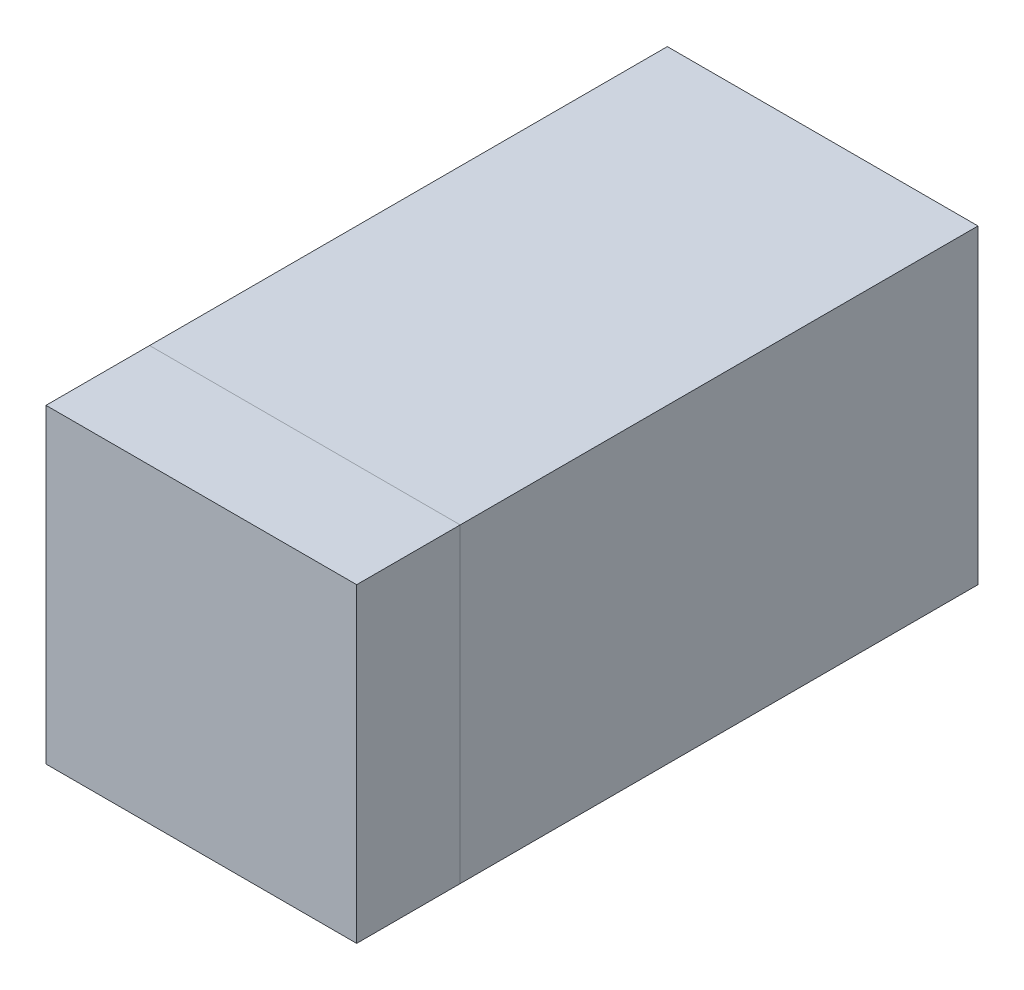
ISO-10303-21;
HEADER;
FILE_DESCRIPTION(('STEP AP214'),'2;1');
FILE_NAME('part.step','',(''),(''),'','','');
FILE_SCHEMA(('AUTOMOTIVE_DESIGN { 1 0 10303 214 1 1 1 1 }'));
ENDSEC;
DATA;
#1=APPLICATION_CONTEXT('core data for automotive mechanical design processes');
#2=APPLICATION_PROTOCOL_DEFINITION('international standard','automotive_design',2000,#1);
#3=PRODUCT_CONTEXT('',#1,'mechanical');
#4=PRODUCT('Part','Part','',(#3));
#5=PRODUCT_RELATED_PRODUCT_CATEGORY('part','',(#4));
#6=PRODUCT_DEFINITION_FORMATION('','',#4);
#7=PRODUCT_DEFINITION_CONTEXT('part definition',#1,'design');
#8=PRODUCT_DEFINITION('design','',#6,#7);
#9=PRODUCT_DEFINITION_SHAPE('','',#8);
#10=(LENGTH_UNIT() NAMED_UNIT(*) SI_UNIT(.MILLI.,.METRE.));
#11=(NAMED_UNIT(*) PLANE_ANGLE_UNIT() SI_UNIT($,.RADIAN.));
#12=(NAMED_UNIT(*) SI_UNIT($,.STERADIAN.) SOLID_ANGLE_UNIT());
#13=UNCERTAINTY_MEASURE_WITH_UNIT(LENGTH_MEASURE(1.E-05),#10,'distance_accuracy_value','');
#14=(GEOMETRIC_REPRESENTATION_CONTEXT(3) GLOBAL_UNCERTAINTY_ASSIGNED_CONTEXT((#13)) GLOBAL_UNIT_ASSIGNED_CONTEXT((#10,
#11,#12)) REPRESENTATION_CONTEXT('',''));
#15=CARTESIAN_POINT('',(0.,0.,0.));
#16=DIRECTION('',(0.,0.,1.));
#17=DIRECTION('',(1.,0.,0.));
#18=AXIS2_PLACEMENT_3D('',#15,#16,#17);
#19=CARTESIAN_POINT('',(47.625,-2.54,139.7));
#20=DIRECTION('',(1.,0.,0.));
#21=DIRECTION('',(0.,0.,-1.));
#22=AXIS2_PLACEMENT_3D('',#19,#20,#21);
#23=PLANE('',#22);
#24=DIRECTION('',(0.,0.,-1.));
#25=VECTOR('',#24,1.);
#26=CARTESIAN_POINT('',(47.625,0.,139.7));
#27=LINE('',#26,#25);
#28=CARTESIAN_POINT('',(47.625,0.,139.7));
#29=VERTEX_POINT('',#28);
#30=CARTESIAN_POINT('',(47.625,0.,12.7));
#31=VERTEX_POINT('',#30);
#32=EDGE_CURVE('E115',#29,#31,#27,.T.);
#33=ORIENTED_EDGE('',*,*,#32,.T.);
#34=DIRECTION('',(0.,1.,0.));
#35=VECTOR('',#34,1.);
#36=CARTESIAN_POINT('',(47.625,-2.54,12.7));
#37=LINE('',#36,#35);
#38=CARTESIAN_POINT('',(47.625,-2.54,12.7));
#39=VERTEX_POINT('',#38);
#40=EDGE_CURVE('E12',#39,#31,#37,.T.);
#41=ORIENTED_EDGE('',*,*,#40,.F.);
#42=DIRECTION('',(0.,0.,-1.));
#43=VECTOR('',#42,1.);
#44=CARTESIAN_POINT('',(47.625,-2.54,139.7));
#45=LINE('',#44,#43);
#46=CARTESIAN_POINT('',(47.625,-2.54,139.7));
#47=VERTEX_POINT('',#46);
#48=EDGE_CURVE('E103',#47,#39,#45,.T.);
#49=ORIENTED_EDGE('',*,*,#48,.F.);
#50=DIRECTION('',(0.,1.,0.));
#51=VECTOR('',#50,1.);
#52=CARTESIAN_POINT('',(47.625,-2.54,139.7));
#53=LINE('',#52,#51);
#54=EDGE_CURVE('E111',#47,#29,#53,.T.);
#55=ORIENTED_EDGE('',*,*,#54,.T.);
#56=EDGE_LOOP('',(#33,#41,#49,#55));
#57=FACE_BOUND('',#56,.T.);
#58=ADVANCED_FACE('F52',(#57),#23,.F.);
#59=CARTESIAN_POINT('',(47.625,-2.54,12.7));
#60=DIRECTION('',(0.,0.,1.));
#61=DIRECTION('',(1.,0.,0.));
#62=AXIS2_PLACEMENT_3D('',#59,#60,#61);
#63=PLANE('',#62);
#64=DIRECTION('',(1.,0.,0.));
#65=VECTOR('',#64,1.);
#66=CARTESIAN_POINT('',(47.625,0.,12.7));
#67=LINE('',#66,#65);
#68=CARTESIAN_POINT('',(63.5,0.,12.7));
#69=VERTEX_POINT('',#68);
#70=EDGE_CURVE('E107',#31,#69,#67,.T.);
#71=ORIENTED_EDGE('',*,*,#70,.T.);
#72=DIRECTION('',(0.,1.,0.));
#73=VECTOR('',#72,1.);
#74=CARTESIAN_POINT('',(63.5,-2.54,12.7));
#75=LINE('',#74,#73);
#76=CARTESIAN_POINT('',(63.5,-2.54,12.7));
#77=VERTEX_POINT('',#76);
#78=EDGE_CURVE('E60',#77,#69,#75,.T.);
#79=ORIENTED_EDGE('',*,*,#78,.F.);
#80=DIRECTION('',(1.,0.,0.));
#81=VECTOR('',#80,1.);
#82=CARTESIAN_POINT('',(47.625,-2.54,12.7));
#83=LINE('',#82,#81);
#84=EDGE_CURVE('E98',#39,#77,#83,.T.);
#85=ORIENTED_EDGE('',*,*,#84,.F.);
#86=ORIENTED_EDGE('',*,*,#40,.T.);
#87=EDGE_LOOP('',(#71,#79,#85,#86));
#88=FACE_BOUND('',#87,.T.);
#89=ADVANCED_FACE('F106',(#88),#63,.F.);
#90=CARTESIAN_POINT('',(63.5,-2.54,139.7));
#91=DIRECTION('',(-1.,0.,0.));
#92=DIRECTION('',(0.,0.,1.));
#93=AXIS2_PLACEMENT_3D('',#90,#91,#92);
#94=PLANE('',#93);
#95=DIRECTION('',(0.,0.,1.));
#96=VECTOR('',#95,1.);
#97=CARTESIAN_POINT('',(63.5,0.,139.7));
#98=LINE('',#97,#96);
#99=CARTESIAN_POINT('',(63.5,0.,139.7));
#100=VERTEX_POINT('',#99);
#101=EDGE_CURVE('E85',#69,#100,#98,.T.);
#102=ORIENTED_EDGE('',*,*,#101,.T.);
#103=DIRECTION('',(0.,1.,0.));
#104=VECTOR('',#103,1.);
#105=CARTESIAN_POINT('',(63.5,-2.54,139.7));
#106=LINE('',#105,#104);
#107=CARTESIAN_POINT('',(63.5,-2.54,139.7));
#108=VERTEX_POINT('',#107);
#109=EDGE_CURVE('E108',#108,#100,#106,.T.);
#110=ORIENTED_EDGE('',*,*,#109,.F.);
#111=DIRECTION('',(0.,0.,1.));
#112=VECTOR('',#111,1.);
#113=CARTESIAN_POINT('',(63.5,-2.54,139.7));
#114=LINE('',#113,#112);
#115=EDGE_CURVE('E101',#77,#108,#114,.T.);
#116=ORIENTED_EDGE('',*,*,#115,.F.);
#117=ORIENTED_EDGE('',*,*,#78,.T.);
#118=EDGE_LOOP('',(#102,#110,#116,#117));
#119=FACE_BOUND('',#118,.T.);
#120=ADVANCED_FACE('F109',(#119),#94,.F.);
#121=CARTESIAN_POINT('',(47.625,-2.54,139.7));
#122=DIRECTION('',(0.,0.,-1.));
#123=DIRECTION('',(-1.,0.,0.));
#124=AXIS2_PLACEMENT_3D('',#121,#122,#123);
#125=PLANE('',#124);
#126=DIRECTION('',(-1.,0.,0.));
#127=VECTOR('',#126,1.);
#128=CARTESIAN_POINT('',(47.625,0.,139.7));
#129=LINE('',#128,#127);
#130=EDGE_CURVE('E91',#100,#29,#129,.T.);
#131=ORIENTED_EDGE('',*,*,#130,.T.);
#132=ORIENTED_EDGE('',*,*,#54,.F.);
#133=DIRECTION('',(-1.,0.,0.));
#134=VECTOR('',#133,1.);
#135=CARTESIAN_POINT('',(47.625,-2.54,139.7));
#136=LINE('',#135,#134);
#137=EDGE_CURVE('E68',#108,#47,#136,.T.);
#138=ORIENTED_EDGE('',*,*,#137,.F.);
#139=ORIENTED_EDGE('',*,*,#109,.T.);
#140=EDGE_LOOP('',(#131,#132,#138,#139));
#141=FACE_BOUND('',#140,.T.);
#142=ADVANCED_FACE('F122',(#141),#125,.F.);
#143=CARTESIAN_POINT('',(0.,-2.54,0.));
#144=DIRECTION('',(0.,-1.,0.));
#145=DIRECTION('',(0.,0.,-1.));
#146=AXIS2_PLACEMENT_3D('',#143,#144,#145);
#147=PLANE('',#146);
#148=ORIENTED_EDGE('',*,*,#48,.T.);
#149=ORIENTED_EDGE('',*,*,#84,.T.);
#150=ORIENTED_EDGE('',*,*,#115,.T.);
#151=ORIENTED_EDGE('',*,*,#137,.T.);
#152=EDGE_LOOP('',(#148,#149,#150,#151));
#153=FACE_BOUND('',#152,.T.);
#154=ADVANCED_FACE('F99',(#153),#147,.T.);
#155=CARTESIAN_POINT('',(0.,0.,0.));
#156=DIRECTION('',(0.,-1.,0.));
#157=DIRECTION('',(0.,0.,-1.));
#158=AXIS2_PLACEMENT_3D('',#155,#156,#157);
#159=PLANE('',#158);
#160=ORIENTED_EDGE('',*,*,#32,.F.);
#161=ORIENTED_EDGE('',*,*,#130,.F.);
#162=ORIENTED_EDGE('',*,*,#101,.F.);
#163=ORIENTED_EDGE('',*,*,#70,.F.);
#164=EDGE_LOOP('',(#160,#161,#162,#163));
#165=FACE_BOUND('',#164,.T.);
#166=ADVANCED_FACE('F125',(#165),#159,.F.);
#167=CLOSED_SHELL('',(#58,#89,#120,#142,#154,#166));
#168=MANIFOLD_SOLID_BREP('B2',#167);
#169=CARTESIAN_POINT('',(12.7,-2.54,12.7));
#170=DIRECTION('',(1.,0.,0.));
#171=DIRECTION('',(0.,0.,-1.));
#172=AXIS2_PLACEMENT_3D('',#169,#170,#171);
#173=PLANE('',#172);
#174=DIRECTION('',(0.,0.,-1.));
#175=VECTOR('',#174,1.);
#176=CARTESIAN_POINT('',(12.7,0.,12.7));
#177=LINE('',#176,#175);
#178=CARTESIAN_POINT('',(12.7,0.,139.7));
#179=VERTEX_POINT('',#178);
#180=CARTESIAN_POINT('',(12.7,0.,12.7));
#181=VERTEX_POINT('',#180);
#182=EDGE_CURVE('E249',#179,#181,#177,.T.);
#183=ORIENTED_EDGE('',*,*,#182,.T.);
#184=DIRECTION('',(0.,1.,0.));
#185=VECTOR('',#184,1.);
#186=CARTESIAN_POINT('',(12.7,-2.54,12.7));
#187=LINE('',#186,#185);
#188=CARTESIAN_POINT('',(12.7,-2.54,12.7));
#189=VERTEX_POINT('',#188);
#190=EDGE_CURVE('E50',#189,#181,#187,.T.);
#191=ORIENTED_EDGE('',*,*,#190,.F.);
#192=DIRECTION('',(0.,0.,-1.));
#193=VECTOR('',#192,1.);
#194=CARTESIAN_POINT('',(12.7,-2.54,12.7));
#195=LINE('',#194,#193);
#196=CARTESIAN_POINT('',(12.7,-2.54,139.7));
#197=VERTEX_POINT('',#196);
#198=EDGE_CURVE('E237',#197,#189,#195,.T.);
#199=ORIENTED_EDGE('',*,*,#198,.F.);
#200=DIRECTION('',(0.,1.,0.));
#201=VECTOR('',#200,1.);
#202=CARTESIAN_POINT('',(12.7,-2.54,139.7));
#203=LINE('',#202,#201);
#204=EDGE_CURVE('E245',#197,#179,#203,.T.);
#205=ORIENTED_EDGE('',*,*,#204,.T.);
#206=EDGE_LOOP('',(#183,#191,#199,#205));
#207=FACE_BOUND('',#206,.T.);
#208=ADVANCED_FACE('F186',(#207),#173,.F.);
#209=CARTESIAN_POINT('',(12.7,-2.54,12.7));
#210=DIRECTION('',(0.,0.,1.));
#211=DIRECTION('',(1.,0.,0.));
#212=AXIS2_PLACEMENT_3D('',#209,#210,#211);
#213=PLANE('',#212);
#214=DIRECTION('',(1.,0.,0.));
#215=VECTOR('',#214,1.);
#216=CARTESIAN_POINT('',(12.7,0.,12.7));
#217=LINE('',#216,#215);
#218=CARTESIAN_POINT('',(28.575,0.,12.7));
#219=VERTEX_POINT('',#218);
#220=EDGE_CURVE('E241',#181,#219,#217,.T.);
#221=ORIENTED_EDGE('',*,*,#220,.T.);
#222=DIRECTION('',(0.,1.,0.));
#223=VECTOR('',#222,1.);
#224=CARTESIAN_POINT('',(28.575,-2.54,12.7));
#225=LINE('',#224,#223);
#226=CARTESIAN_POINT('',(28.575,-2.54,12.7));
#227=VERTEX_POINT('',#226);
#228=EDGE_CURVE('E194',#227,#219,#225,.T.);
#229=ORIENTED_EDGE('',*,*,#228,.F.);
#230=DIRECTION('',(1.,0.,0.));
#231=VECTOR('',#230,1.);
#232=CARTESIAN_POINT('',(12.7,-2.54,12.7));
#233=LINE('',#232,#231);
#234=EDGE_CURVE('E232',#189,#227,#233,.T.);
#235=ORIENTED_EDGE('',*,*,#234,.F.);
#236=ORIENTED_EDGE('',*,*,#190,.T.);
#237=EDGE_LOOP('',(#221,#229,#235,#236));
#238=FACE_BOUND('',#237,.T.);
#239=ADVANCED_FACE('F240',(#238),#213,.F.);
#240=CARTESIAN_POINT('',(28.575,-2.54,12.7));
#241=DIRECTION('',(-1.,0.,0.));
#242=DIRECTION('',(0.,0.,1.));
#243=AXIS2_PLACEMENT_3D('',#240,#241,#242);
#244=PLANE('',#243);
#245=DIRECTION('',(0.,0.,1.));
#246=VECTOR('',#245,1.);
#247=CARTESIAN_POINT('',(28.575,0.,12.7));
#248=LINE('',#247,#246);
#249=CARTESIAN_POINT('',(28.575,0.,139.7));
#250=VERTEX_POINT('',#249);
#251=EDGE_CURVE('E219',#219,#250,#248,.T.);
#252=ORIENTED_EDGE('',*,*,#251,.T.);
#253=DIRECTION('',(0.,1.,0.));
#254=VECTOR('',#253,1.);
#255=CARTESIAN_POINT('',(28.575,-2.54,139.7));
#256=LINE('',#255,#254);
#257=CARTESIAN_POINT('',(28.575,-2.54,139.7));
#258=VERTEX_POINT('',#257);
#259=EDGE_CURVE('E242',#258,#250,#256,.T.);
#260=ORIENTED_EDGE('',*,*,#259,.F.);
#261=DIRECTION('',(0.,0.,1.));
#262=VECTOR('',#261,1.);
#263=CARTESIAN_POINT('',(28.575,-2.54,12.7));
#264=LINE('',#263,#262);
#265=EDGE_CURVE('E235',#227,#258,#264,.T.);
#266=ORIENTED_EDGE('',*,*,#265,.F.);
#267=ORIENTED_EDGE('',*,*,#228,.T.);
#268=EDGE_LOOP('',(#252,#260,#266,#267));
#269=FACE_BOUND('',#268,.T.);
#270=ADVANCED_FACE('F243',(#269),#244,.F.);
#271=CARTESIAN_POINT('',(12.7,-2.54,139.7));
#272=DIRECTION('',(0.,0.,-1.));
#273=DIRECTION('',(-1.,0.,0.));
#274=AXIS2_PLACEMENT_3D('',#271,#272,#273);
#275=PLANE('',#274);
#276=DIRECTION('',(-1.,0.,0.));
#277=VECTOR('',#276,1.);
#278=CARTESIAN_POINT('',(12.7,0.,139.7));
#279=LINE('',#278,#277);
#280=EDGE_CURVE('E225',#250,#179,#279,.T.);
#281=ORIENTED_EDGE('',*,*,#280,.T.);
#282=ORIENTED_EDGE('',*,*,#204,.F.);
#283=DIRECTION('',(-1.,0.,0.));
#284=VECTOR('',#283,1.);
#285=CARTESIAN_POINT('',(12.7,-2.54,139.7));
#286=LINE('',#285,#284);
#287=EDGE_CURVE('E202',#258,#197,#286,.T.);
#288=ORIENTED_EDGE('',*,*,#287,.F.);
#289=ORIENTED_EDGE('',*,*,#259,.T.);
#290=EDGE_LOOP('',(#281,#282,#288,#289));
#291=FACE_BOUND('',#290,.T.);
#292=ADVANCED_FACE('F256',(#291),#275,.F.);
#293=CARTESIAN_POINT('',(0.,-2.54,0.));
#294=DIRECTION('',(0.,1.,0.));
#295=DIRECTION('',(0.,0.,1.));
#296=AXIS2_PLACEMENT_3D('',#293,#294,#295);
#297=PLANE('',#296);
#298=ORIENTED_EDGE('',*,*,#198,.T.);
#299=ORIENTED_EDGE('',*,*,#234,.T.);
#300=ORIENTED_EDGE('',*,*,#265,.T.);
#301=ORIENTED_EDGE('',*,*,#287,.T.);
#302=EDGE_LOOP('',(#298,#299,#300,#301));
#303=FACE_BOUND('',#302,.T.);
#304=ADVANCED_FACE('F233',(#303),#297,.F.);
#305=CARTESIAN_POINT('',(0.,0.,0.));
#306=DIRECTION('',(0.,1.,0.));
#307=DIRECTION('',(0.,0.,1.));
#308=AXIS2_PLACEMENT_3D('',#305,#306,#307);
#309=PLANE('',#308);
#310=ORIENTED_EDGE('',*,*,#182,.F.);
#311=ORIENTED_EDGE('',*,*,#280,.F.);
#312=ORIENTED_EDGE('',*,*,#251,.F.);
#313=ORIENTED_EDGE('',*,*,#220,.F.);
#314=EDGE_LOOP('',(#310,#311,#312,#313));
#315=FACE_BOUND('',#314,.T.);
#316=ADVANCED_FACE('F259',(#315),#309,.T.);
#317=CLOSED_SHELL('',(#208,#239,#270,#292,#304,#316));
#318=MANIFOLD_SOLID_BREP('B6',#317);
#319=CARTESIAN_POINT('',(0.,0.,152.4));
#320=DIRECTION('',(1.,0.,0.));
#321=DIRECTION('',(0.,0.,-1.));
#322=AXIS2_PLACEMENT_3D('',#319,#320,#321);
#323=PLANE('',#322);
#324=DIRECTION('',(0.,-1.,0.));
#325=VECTOR('',#324,1.);
#326=CARTESIAN_POINT('',(0.,0.,127.));
#327=LINE('',#326,#325);
#328=CARTESIAN_POINT('',(0.,76.2,127.));
#329=VERTEX_POINT('',#328);
#330=CARTESIAN_POINT('',(0.,0.,127.));
#331=VERTEX_POINT('',#330);
#332=EDGE_CURVE('E382',#329,#331,#327,.T.);
#333=ORIENTED_EDGE('',*,*,#332,.T.);
#334=DIRECTION('',(0.,0.,-1.));
#335=VECTOR('',#334,1.);
#336=CARTESIAN_POINT('',(0.,0.,152.4));
#337=LINE('',#336,#335);
#338=CARTESIAN_POINT('',(0.,0.,152.4));
#339=VERTEX_POINT('',#338);
#340=EDGE_CURVE('E184',#339,#331,#337,.T.);
#341=ORIENTED_EDGE('',*,*,#340,.F.);
#342=DIRECTION('',(0.,-1.,0.));
#343=VECTOR('',#342,1.);
#344=CARTESIAN_POINT('',(0.,0.,152.4));
#345=LINE('',#344,#343);
#346=CARTESIAN_POINT('',(0.,76.2,152.4));
#347=VERTEX_POINT('',#346);
#348=EDGE_CURVE('E370',#347,#339,#345,.T.);
#349=ORIENTED_EDGE('',*,*,#348,.F.);
#350=DIRECTION('',(0.,0.,-1.));
#351=VECTOR('',#350,1.);
#352=CARTESIAN_POINT('',(0.,76.2,152.4));
#353=LINE('',#352,#351);
#354=EDGE_CURVE('E378',#347,#329,#353,.T.);
#355=ORIENTED_EDGE('',*,*,#354,.T.);
#356=EDGE_LOOP('',(#333,#341,#349,#355));
#357=FACE_BOUND('',#356,.T.);
#358=ADVANCED_FACE('F319',(#357),#323,.F.);
#359=CARTESIAN_POINT('',(0.,0.,152.4));
#360=DIRECTION('',(0.,1.,0.));
#361=DIRECTION('',(0.,0.,1.));
#362=AXIS2_PLACEMENT_3D('',#359,#360,#361);
#363=PLANE('',#362);
#364=DIRECTION('',(1.,0.,0.));
#365=VECTOR('',#364,1.);
#366=CARTESIAN_POINT('',(0.,0.,127.));
#367=LINE('',#366,#365);
#368=CARTESIAN_POINT('',(76.2,0.,127.));
#369=VERTEX_POINT('',#368);
#370=EDGE_CURVE('E374',#331,#369,#367,.T.);
#371=ORIENTED_EDGE('',*,*,#370,.T.);
#372=DIRECTION('',(0.,0.,-1.));
#373=VECTOR('',#372,1.);
#374=CARTESIAN_POINT('',(76.2,0.,152.4));
#375=LINE('',#374,#373);
#376=CARTESIAN_POINT('',(76.2,0.,152.4));
#377=VERTEX_POINT('',#376);
#378=EDGE_CURVE('E327',#377,#369,#375,.T.);
#379=ORIENTED_EDGE('',*,*,#378,.F.);
#380=DIRECTION('',(1.,0.,0.));
#381=VECTOR('',#380,1.);
#382=CARTESIAN_POINT('',(0.,0.,152.4));
#383=LINE('',#382,#381);
#384=EDGE_CURVE('E365',#339,#377,#383,.T.);
#385=ORIENTED_EDGE('',*,*,#384,.F.);
#386=ORIENTED_EDGE('',*,*,#340,.T.);
#387=EDGE_LOOP('',(#371,#379,#385,#386));
#388=FACE_BOUND('',#387,.T.);
#389=ADVANCED_FACE('F373',(#388),#363,.F.);
#390=CARTESIAN_POINT('',(76.2,0.,152.4));
#391=DIRECTION('',(-1.,0.,0.));
#392=DIRECTION('',(0.,0.,1.));
#393=AXIS2_PLACEMENT_3D('',#390,#391,#392);
#394=PLANE('',#393);
#395=DIRECTION('',(0.,1.,0.));
#396=VECTOR('',#395,1.);
#397=CARTESIAN_POINT('',(76.2,0.,127.));
#398=LINE('',#397,#396);
#399=CARTESIAN_POINT('',(76.2,76.2,127.));
#400=VERTEX_POINT('',#399);
#401=EDGE_CURVE('E352',#369,#400,#398,.T.);
#402=ORIENTED_EDGE('',*,*,#401,.T.);
#403=DIRECTION('',(0.,0.,-1.));
#404=VECTOR('',#403,1.);
#405=CARTESIAN_POINT('',(76.2,76.2,152.4));
#406=LINE('',#405,#404);
#407=CARTESIAN_POINT('',(76.2,76.2,152.4));
#408=VERTEX_POINT('',#407);
#409=EDGE_CURVE('E375',#408,#400,#406,.T.);
#410=ORIENTED_EDGE('',*,*,#409,.F.);
#411=DIRECTION('',(0.,1.,0.));
#412=VECTOR('',#411,1.);
#413=CARTESIAN_POINT('',(76.2,0.,152.4));
#414=LINE('',#413,#412);
#415=EDGE_CURVE('E368',#377,#408,#414,.T.);
#416=ORIENTED_EDGE('',*,*,#415,.F.);
#417=ORIENTED_EDGE('',*,*,#378,.T.);
#418=EDGE_LOOP('',(#402,#410,#416,#417));
#419=FACE_BOUND('',#418,.T.);
#420=ADVANCED_FACE('F376',(#419),#394,.F.);
#421=CARTESIAN_POINT('',(0.,76.2,152.4));
#422=DIRECTION('',(0.,-1.,0.));
#423=DIRECTION('',(0.,0.,-1.));
#424=AXIS2_PLACEMENT_3D('',#421,#422,#423);
#425=PLANE('',#424);
#426=DIRECTION('',(-1.,0.,0.));
#427=VECTOR('',#426,1.);
#428=CARTESIAN_POINT('',(0.,76.2,127.));
#429=LINE('',#428,#427);
#430=EDGE_CURVE('E358',#400,#329,#429,.T.);
#431=ORIENTED_EDGE('',*,*,#430,.T.);
#432=ORIENTED_EDGE('',*,*,#354,.F.);
#433=DIRECTION('',(-1.,0.,0.));
#434=VECTOR('',#433,1.);
#435=CARTESIAN_POINT('',(0.,76.2,152.4));
#436=LINE('',#435,#434);
#437=EDGE_CURVE('E335',#408,#347,#436,.T.);
#438=ORIENTED_EDGE('',*,*,#437,.F.);
#439=ORIENTED_EDGE('',*,*,#409,.T.);
#440=EDGE_LOOP('',(#431,#432,#438,#439));
#441=FACE_BOUND('',#440,.T.);
#442=ADVANCED_FACE('F389',(#441),#425,.F.);
#443=CARTESIAN_POINT('',(0.,0.,152.4));
#444=DIRECTION('',(0.,0.,-1.));
#445=DIRECTION('',(-1.,0.,0.));
#446=AXIS2_PLACEMENT_3D('',#443,#444,#445);
#447=PLANE('',#446);
#448=ORIENTED_EDGE('',*,*,#348,.T.);
#449=ORIENTED_EDGE('',*,*,#384,.T.);
#450=ORIENTED_EDGE('',*,*,#415,.T.);
#451=ORIENTED_EDGE('',*,*,#437,.T.);
#452=EDGE_LOOP('',(#448,#449,#450,#451));
#453=FACE_BOUND('',#452,.T.);
#454=ADVANCED_FACE('F366',(#453),#447,.F.);
#455=CARTESIAN_POINT('',(0.,0.,127.));
#456=DIRECTION('',(0.,0.,-1.));
#457=DIRECTION('',(-1.,0.,0.));
#458=AXIS2_PLACEMENT_3D('',#455,#456,#457);
#459=PLANE('',#458);
#460=ORIENTED_EDGE('',*,*,#332,.F.);
#461=ORIENTED_EDGE('',*,*,#430,.F.);
#462=ORIENTED_EDGE('',*,*,#401,.F.);
#463=ORIENTED_EDGE('',*,*,#370,.F.);
#464=EDGE_LOOP('',(#460,#461,#462,#463));
#465=FACE_BOUND('',#464,.T.);
#466=ADVANCED_FACE('F392',(#465),#459,.T.);
#467=CLOSED_SHELL('',(#358,#389,#420,#442,#454,#466));
#468=MANIFOLD_SOLID_BREP('B44',#467);
#469=CARTESIAN_POINT('',(0.,0.,127.));
#470=DIRECTION('',(1.,0.,0.));
#471=DIRECTION('',(0.,0.,-1.));
#472=AXIS2_PLACEMENT_3D('',#469,#470,#471);
#473=PLANE('',#472);
#474=DIRECTION('',(0.,-1.,0.));
#475=VECTOR('',#474,1.);
#476=CARTESIAN_POINT('',(0.,0.,0.));
#477=LINE('',#476,#475);
#478=CARTESIAN_POINT('',(0.,76.2,0.));
#479=VERTEX_POINT('',#478);
#480=CARTESIAN_POINT('',(0.,0.,0.));
#481=VERTEX_POINT('',#480);
#482=EDGE_CURVE('E511',#479,#481,#477,.T.);
#483=ORIENTED_EDGE('',*,*,#482,.T.);
#484=DIRECTION('',(0.,0.,-1.));
#485=VECTOR('',#484,1.);
#486=CARTESIAN_POINT('',(0.,0.,127.));
#487=LINE('',#486,#485);
#488=CARTESIAN_POINT('',(0.,0.,127.));
#489=VERTEX_POINT('',#488);
#490=EDGE_CURVE('E317',#489,#481,#487,.T.);
#491=ORIENTED_EDGE('',*,*,#490,.F.);
#492=DIRECTION('',(0.,-1.,0.));
#493=VECTOR('',#492,1.);
#494=CARTESIAN_POINT('',(0.,0.,127.));
#495=LINE('',#494,#493);
#496=CARTESIAN_POINT('',(0.,76.2,127.));
#497=VERTEX_POINT('',#496);
#498=EDGE_CURVE('E495',#497,#489,#495,.T.);
#499=ORIENTED_EDGE('',*,*,#498,.F.);
#500=DIRECTION('',(0.,0.,-1.));
#501=VECTOR('',#500,1.);
#502=CARTESIAN_POINT('',(0.,76.2,127.));
#503=LINE('',#502,#501);
#504=EDGE_CURVE('E507',#497,#479,#503,.T.);
#505=ORIENTED_EDGE('',*,*,#504,.T.);
#506=EDGE_LOOP('',(#483,#491,#499,#505));
#507=FACE_BOUND('',#506,.T.);
#508=ADVANCED_FACE('F443',(#507),#473,.F.);
#509=CARTESIAN_POINT('',(0.,0.,127.));
#510=DIRECTION('',(0.,1.,0.));
#511=DIRECTION('',(0.,0.,1.));
#512=AXIS2_PLACEMENT_3D('',#509,#510,#511);
#513=PLANE('',#512);
#514=DIRECTION('',(1.,0.,0.));
#515=VECTOR('',#514,1.);
#516=CARTESIAN_POINT('',(0.,0.,0.));
#517=LINE('',#516,#515);
#518=CARTESIAN_POINT('',(76.2,0.,0.));
#519=VERTEX_POINT('',#518);
#520=EDGE_CURVE('E500',#481,#519,#517,.T.);
#521=ORIENTED_EDGE('',*,*,#520,.T.);
#522=DIRECTION('',(0.,0.,-1.));
#523=VECTOR('',#522,1.);
#524=CARTESIAN_POINT('',(76.2,0.,127.));
#525=LINE('',#524,#523);
#526=CARTESIAN_POINT('',(76.2,0.,127.));
#527=VERTEX_POINT('',#526);
#528=EDGE_CURVE('E452',#527,#519,#525,.T.);
#529=ORIENTED_EDGE('',*,*,#528,.F.);
#530=DIRECTION('',(1.,0.,0.));
#531=VECTOR('',#530,1.);
#532=CARTESIAN_POINT('',(0.,0.,127.));
#533=LINE('',#532,#531);
#534=EDGE_CURVE('E490',#489,#527,#533,.T.);
#535=ORIENTED_EDGE('',*,*,#534,.F.);
#536=ORIENTED_EDGE('',*,*,#490,.T.);
#537=EDGE_LOOP('',(#521,#529,#535,#536));
#538=FACE_BOUND('',#537,.T.);
#539=ADVANCED_FACE('F499',(#538),#513,.F.);
#540=CARTESIAN_POINT('',(76.2,0.,127.));
#541=DIRECTION('',(-1.,0.,0.));
#542=DIRECTION('',(0.,0.,1.));
#543=AXIS2_PLACEMENT_3D('',#540,#541,#542);
#544=PLANE('',#543);
#545=DIRECTION('',(0.,1.,0.));
#546=VECTOR('',#545,1.);
#547=CARTESIAN_POINT('',(76.2,0.,0.));
#548=LINE('',#547,#546);
#549=CARTESIAN_POINT('',(76.2,76.2,0.));
#550=VERTEX_POINT('',#549);
#551=EDGE_CURVE('E477',#519,#550,#548,.T.);
#552=ORIENTED_EDGE('',*,*,#551,.T.);
#553=DIRECTION('',(0.,0.,-1.));
#554=VECTOR('',#553,1.);
#555=CARTESIAN_POINT('',(76.2,76.2,127.));
#556=LINE('',#555,#554);
#557=CARTESIAN_POINT('',(76.2,76.2,127.));
#558=VERTEX_POINT('',#557);
#559=EDGE_CURVE('E502',#558,#550,#556,.T.);
#560=ORIENTED_EDGE('',*,*,#559,.F.);
#561=DIRECTION('',(0.,1.,0.));
#562=VECTOR('',#561,1.);
#563=CARTESIAN_POINT('',(76.2,0.,127.));
#564=LINE('',#563,#562);
#565=EDGE_CURVE('E493',#527,#558,#564,.T.);
#566=ORIENTED_EDGE('',*,*,#565,.F.);
#567=ORIENTED_EDGE('',*,*,#528,.T.);
#568=EDGE_LOOP('',(#552,#560,#566,#567));
#569=FACE_BOUND('',#568,.T.);
#570=ADVANCED_FACE('F503',(#569),#544,.F.);
#571=CARTESIAN_POINT('',(0.,76.2,127.));
#572=DIRECTION('',(0.,-1.,0.));
#573=DIRECTION('',(0.,0.,-1.));
#574=AXIS2_PLACEMENT_3D('',#571,#572,#573);
#575=PLANE('',#574);
#576=DIRECTION('',(-1.,0.,0.));
#577=VECTOR('',#576,1.);
#578=CARTESIAN_POINT('',(0.,76.2,0.));
#579=LINE('',#578,#577);
#580=EDGE_CURVE('E483',#550,#479,#579,.T.);
#581=ORIENTED_EDGE('',*,*,#580,.T.);
#582=ORIENTED_EDGE('',*,*,#504,.F.);
#583=DIRECTION('',(-1.,0.,0.));
#584=VECTOR('',#583,1.);
#585=CARTESIAN_POINT('',(0.,76.2,127.));
#586=LINE('',#585,#584);
#587=EDGE_CURVE('E460',#558,#497,#586,.T.);
#588=ORIENTED_EDGE('',*,*,#587,.F.);
#589=ORIENTED_EDGE('',*,*,#559,.T.);
#590=EDGE_LOOP('',(#581,#582,#588,#589));
#591=FACE_BOUND('',#590,.T.);
#592=ADVANCED_FACE('F524',(#591),#575,.F.);
#593=CARTESIAN_POINT('',(0.,0.,127.));
#594=DIRECTION('',(0.,0.,-1.));
#595=DIRECTION('',(-1.,0.,0.));
#596=AXIS2_PLACEMENT_3D('',#593,#594,#595);
#597=PLANE('',#596);
#598=ORIENTED_EDGE('',*,*,#498,.T.);
#599=ORIENTED_EDGE('',*,*,#534,.T.);
#600=ORIENTED_EDGE('',*,*,#565,.T.);
#601=ORIENTED_EDGE('',*,*,#587,.T.);
#602=EDGE_LOOP('',(#598,#599,#600,#601));
#603=FACE_BOUND('',#602,.T.);
#604=ADVANCED_FACE('F491',(#603),#597,.F.);
#605=CARTESIAN_POINT('',(0.,0.,0.));
#606=DIRECTION('',(0.,0.,-1.));
#607=DIRECTION('',(-1.,0.,0.));
#608=AXIS2_PLACEMENT_3D('',#605,#606,#607);
#609=PLANE('',#608);
#610=ORIENTED_EDGE('',*,*,#482,.F.);
#611=ORIENTED_EDGE('',*,*,#580,.F.);
#612=ORIENTED_EDGE('',*,*,#551,.F.);
#613=ORIENTED_EDGE('',*,*,#520,.F.);
#614=EDGE_LOOP('',(#610,#611,#612,#613));
#615=FACE_BOUND('',#614,.T.);
#616=ADVANCED_FACE('F527',(#615),#609,.T.);
#617=CLOSED_SHELL('',(#508,#539,#570,#592,#604,#616));
#618=MANIFOLD_SOLID_BREP('B178',#617);
#619=ADVANCED_BREP_SHAPE_REPRESENTATION('',(#18,#168,#318,#468,#618),#14);
#620=SHAPE_DEFINITION_REPRESENTATION(#9,#619);
ENDSEC;
END-ISO-10303-21;
